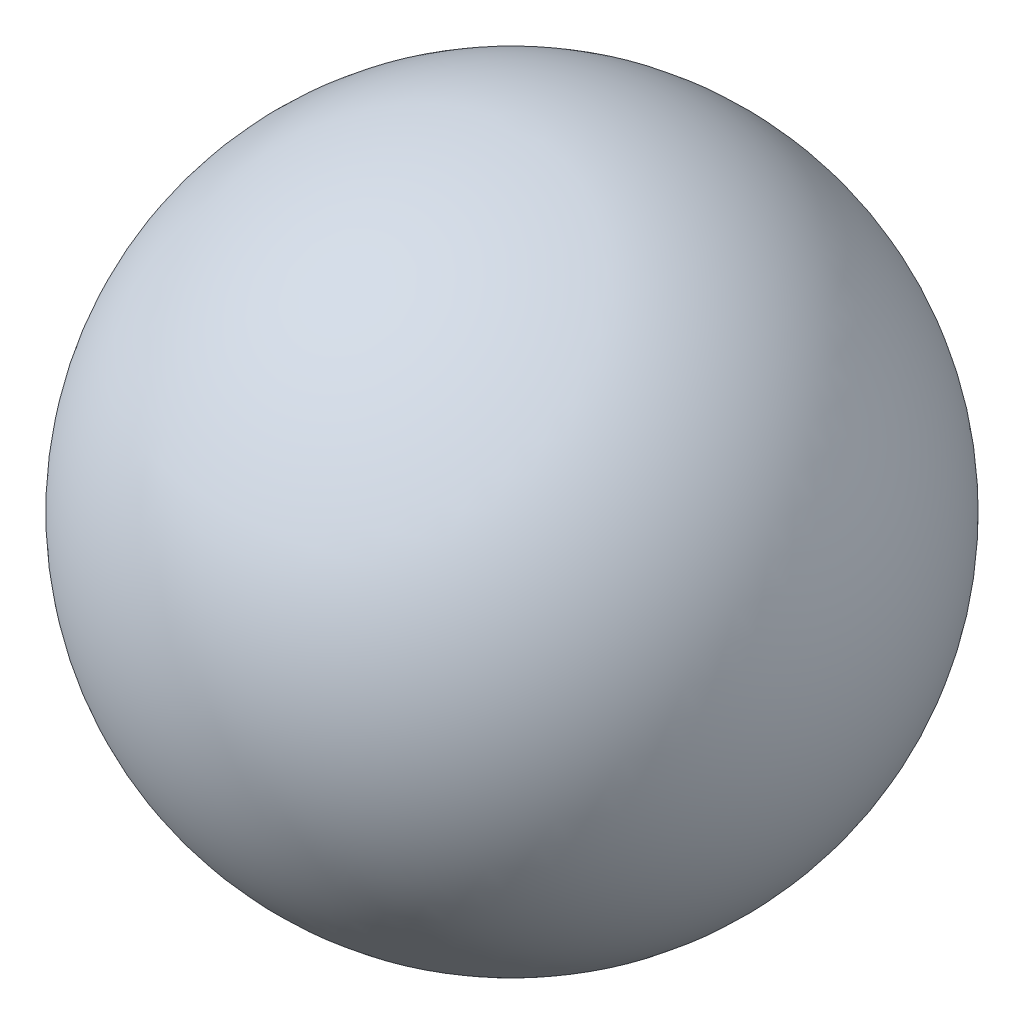
ISO-10303-21;
HEADER;
FILE_DESCRIPTION(('STEP AP214'),'2;1');
FILE_NAME('part.step','',(''),(''),'','','');
FILE_SCHEMA(('AUTOMOTIVE_DESIGN { 1 0 10303 214 1 1 1 1 }'));
ENDSEC;
DATA;
#1=APPLICATION_CONTEXT('core data for automotive mechanical design processes');
#2=APPLICATION_PROTOCOL_DEFINITION('international standard','automotive_design',2000,#1);
#3=PRODUCT_CONTEXT('',#1,'mechanical');
#4=PRODUCT('Part','Part','',(#3));
#5=PRODUCT_RELATED_PRODUCT_CATEGORY('part','',(#4));
#6=PRODUCT_DEFINITION_FORMATION('','',#4);
#7=PRODUCT_DEFINITION_CONTEXT('part definition',#1,'design');
#8=PRODUCT_DEFINITION('design','',#6,#7);
#9=PRODUCT_DEFINITION_SHAPE('','',#8);
#10=(LENGTH_UNIT() NAMED_UNIT(*) SI_UNIT(.MILLI.,.METRE.));
#11=(NAMED_UNIT(*) PLANE_ANGLE_UNIT() SI_UNIT($,.RADIAN.));
#12=(NAMED_UNIT(*) SI_UNIT($,.STERADIAN.) SOLID_ANGLE_UNIT());
#13=UNCERTAINTY_MEASURE_WITH_UNIT(LENGTH_MEASURE(1.E-05),#10,'distance_accuracy_value','');
#14=(GEOMETRIC_REPRESENTATION_CONTEXT(3) GLOBAL_UNCERTAINTY_ASSIGNED_CONTEXT((#13)) GLOBAL_UNIT_ASSIGNED_CONTEXT((#10,
#11,#12)) REPRESENTATION_CONTEXT('',''));
#15=CARTESIAN_POINT('',(0.,0.,0.));
#16=DIRECTION('',(0.,0.,1.));
#17=DIRECTION('',(1.,0.,0.));
#18=AXIS2_PLACEMENT_3D('',#15,#16,#17);
#19=CARTESIAN_POINT('',(0.,0.,0.));
#20=DIRECTION('',(0.,-1.,0.));
#21=DIRECTION('',(-1.,0.,0.));
#22=AXIS2_PLACEMENT_3D('',#19,#20,#21);
#23=SPHERICAL_SURFACE('',#22,88.9);
#24=CARTESIAN_POINT('',(0.,-88.9,0.));
#25=VERTEX_POINT('',#24);
#26=VERTEX_LOOP('',#25);
#27=FACE_BOUND('',#26,.T.);
#28=ADVANCED_FACE('F29',(#27),#23,.T.);
#29=CLOSED_SHELL('',(#28));
#30=MANIFOLD_SOLID_BREP('B2',#29);
#31=ADVANCED_BREP_SHAPE_REPRESENTATION('',(#18,#30),#14);
#32=SHAPE_DEFINITION_REPRESENTATION(#9,#31);
ENDSEC;
END-ISO-10303-21;
